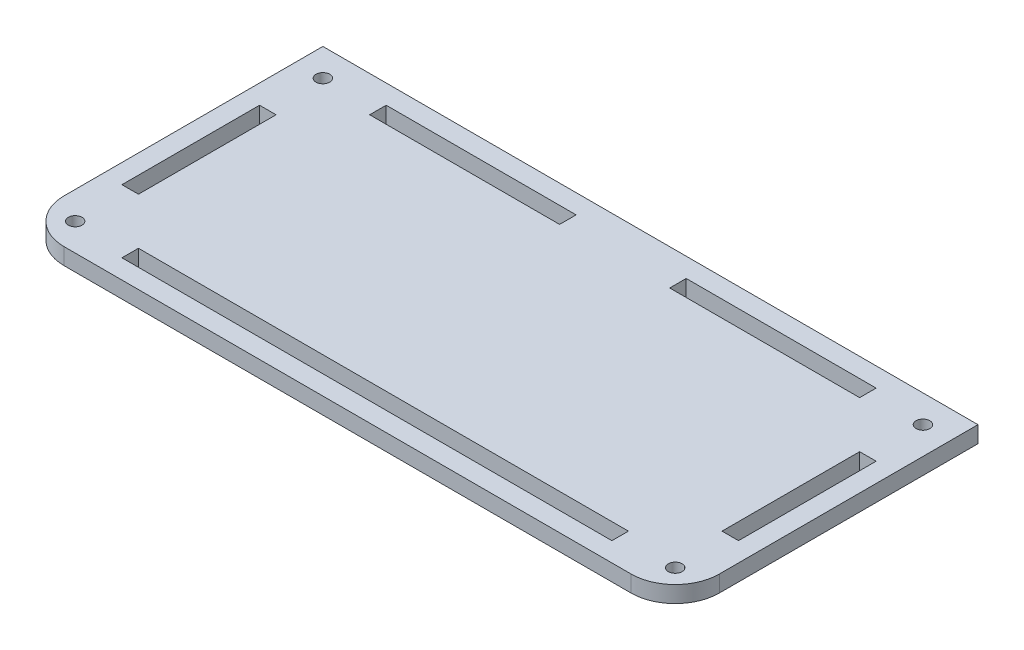
ISO-10303-21;
HEADER;
FILE_DESCRIPTION(('STEP AP214'),'2;1');
FILE_NAME('part.step','',(''),(''),'','','');
FILE_SCHEMA(('AUTOMOTIVE_DESIGN { 1 0 10303 214 1 1 1 1 }'));
ENDSEC;
DATA;
#1=APPLICATION_CONTEXT('core data for automotive mechanical design processes');
#2=APPLICATION_PROTOCOL_DEFINITION('international standard','automotive_design',2000,#1);
#3=PRODUCT_CONTEXT('',#1,'mechanical');
#4=PRODUCT('Part','Part','',(#3));
#5=PRODUCT_RELATED_PRODUCT_CATEGORY('part','',(#4));
#6=PRODUCT_DEFINITION_FORMATION('','',#4);
#7=PRODUCT_DEFINITION_CONTEXT('part definition',#1,'design');
#8=PRODUCT_DEFINITION('design','',#6,#7);
#9=PRODUCT_DEFINITION_SHAPE('','',#8);
#10=(LENGTH_UNIT() NAMED_UNIT(*) SI_UNIT(.MILLI.,.METRE.));
#11=(NAMED_UNIT(*) PLANE_ANGLE_UNIT() SI_UNIT($,.RADIAN.));
#12=(NAMED_UNIT(*) SI_UNIT($,.STERADIAN.) SOLID_ANGLE_UNIT());
#13=UNCERTAINTY_MEASURE_WITH_UNIT(LENGTH_MEASURE(1.E-05),#10,'distance_accuracy_value','');
#14=(GEOMETRIC_REPRESENTATION_CONTEXT(3) GLOBAL_UNCERTAINTY_ASSIGNED_CONTEXT((#13)) GLOBAL_UNIT_ASSIGNED_CONTEXT((#10,
#11,#12)) REPRESENTATION_CONTEXT('',''));
#15=CARTESIAN_POINT('',(0.,0.,0.));
#16=DIRECTION('',(0.,0.,1.));
#17=DIRECTION('',(1.,0.,0.));
#18=AXIS2_PLACEMENT_3D('',#15,#16,#17);
#19=CARTESIAN_POINT('',(59.5,3.,27.5));
#20=DIRECTION('',(-1.,0.,0.));
#21=DIRECTION('',(0.,0.,1.));
#22=AXIS2_PLACEMENT_3D('',#19,#20,#21);
#23=PLANE('',#22);
#24=DIRECTION('',(0.,0.,-1.));
#25=VECTOR('',#24,1.);
#26=CARTESIAN_POINT('',(59.5,3.,27.5));
#27=LINE('',#26,#25);
#28=CARTESIAN_POINT('',(59.5,3.,19.5));
#29=VERTEX_POINT('',#28);
#30=CARTESIAN_POINT('',(59.5,3.,-27.5));
#31=VERTEX_POINT('',#30);
#32=EDGE_CURVE('E388',#29,#31,#27,.T.);
#33=ORIENTED_EDGE('',*,*,#32,.F.);
#34=DIRECTION('',(0.,-1.,0.));
#35=VECTOR('',#34,1.);
#36=CARTESIAN_POINT('',(59.5,3.,19.5));
#37=LINE('',#36,#35);
#38=CARTESIAN_POINT('',(59.5,0.,19.5));
#39=VERTEX_POINT('',#38);
#40=EDGE_CURVE('E431',#29,#39,#37,.T.);
#41=ORIENTED_EDGE('',*,*,#40,.T.);
#42=DIRECTION('',(0.,0.,-1.));
#43=VECTOR('',#42,1.);
#44=CARTESIAN_POINT('',(59.5,0.,27.5));
#45=LINE('',#44,#43);
#46=CARTESIAN_POINT('',(59.5,0.,-27.5));
#47=VERTEX_POINT('',#46);
#48=EDGE_CURVE('E387',#39,#47,#45,.T.);
#49=ORIENTED_EDGE('',*,*,#48,.T.);
#50=DIRECTION('',(0.,-1.,0.));
#51=VECTOR('',#50,1.);
#52=CARTESIAN_POINT('',(59.5,3.,-27.5));
#53=LINE('',#52,#51);
#54=EDGE_CURVE('E413',#31,#47,#53,.T.);
#55=ORIENTED_EDGE('',*,*,#54,.F.);
#56=EDGE_LOOP('',(#33,#41,#49,#55));
#57=FACE_BOUND('',#56,.T.);
#58=ADVANCED_FACE('F41',(#57),#23,.F.);
#59=CARTESIAN_POINT('',(-59.5,3.,-27.5));
#60=DIRECTION('',(0.,0.,1.));
#61=DIRECTION('',(1.,0.,0.));
#62=AXIS2_PLACEMENT_3D('',#59,#60,#61);
#63=PLANE('',#62);
#64=DIRECTION('',(-1.,0.,0.));
#65=VECTOR('',#64,1.);
#66=CARTESIAN_POINT('',(-59.5,0.,-27.5));
#67=LINE('',#66,#65);
#68=CARTESIAN_POINT('',(-59.5,0.,-27.5));
#69=VERTEX_POINT('',#68);
#70=EDGE_CURVE('E403',#47,#69,#67,.T.);
#71=ORIENTED_EDGE('',*,*,#70,.T.);
#72=DIRECTION('',(0.,-1.,0.));
#73=VECTOR('',#72,1.);
#74=CARTESIAN_POINT('',(-59.5,3.,-27.5));
#75=LINE('',#74,#73);
#76=CARTESIAN_POINT('',(-59.5,3.,-27.5));
#77=VERTEX_POINT('',#76);
#78=EDGE_CURVE('E400',#77,#69,#75,.T.);
#79=ORIENTED_EDGE('',*,*,#78,.F.);
#80=DIRECTION('',(-1.,0.,0.));
#81=VECTOR('',#80,1.);
#82=CARTESIAN_POINT('',(-59.5,3.,-27.5));
#83=LINE('',#82,#81);
#84=EDGE_CURVE('E391',#31,#77,#83,.T.);
#85=ORIENTED_EDGE('',*,*,#84,.F.);
#86=ORIENTED_EDGE('',*,*,#54,.T.);
#87=EDGE_LOOP('',(#71,#79,#85,#86));
#88=FACE_BOUND('',#87,.T.);
#89=ADVANCED_FACE('F468',(#88),#63,.F.);
#90=CARTESIAN_POINT('',(-59.5,3.,27.5));
#91=DIRECTION('',(1.,0.,0.));
#92=DIRECTION('',(0.,0.,-1.));
#93=AXIS2_PLACEMENT_3D('',#90,#91,#92);
#94=PLANE('',#93);
#95=DIRECTION('',(0.,0.,1.));
#96=VECTOR('',#95,1.);
#97=CARTESIAN_POINT('',(-59.5,0.,27.5));
#98=LINE('',#97,#96);
#99=CARTESIAN_POINT('',(-59.5,0.,19.5));
#100=VERTEX_POINT('',#99);
#101=EDGE_CURVE('E406',#69,#100,#98,.T.);
#102=ORIENTED_EDGE('',*,*,#101,.T.);
#103=DIRECTION('',(0.,-1.,0.));
#104=VECTOR('',#103,1.);
#105=CARTESIAN_POINT('',(-59.5,3.,19.5));
#106=LINE('',#105,#104);
#107=CARTESIAN_POINT('',(-59.5,3.,19.5));
#108=VERTEX_POINT('',#107);
#109=EDGE_CURVE('E425',#100,#108,#106,.F.);
#110=ORIENTED_EDGE('',*,*,#109,.T.);
#111=DIRECTION('',(0.,0.,1.));
#112=VECTOR('',#111,1.);
#113=CARTESIAN_POINT('',(-59.5,3.,27.5));
#114=LINE('',#113,#112);
#115=EDGE_CURVE('E394',#77,#108,#114,.T.);
#116=ORIENTED_EDGE('',*,*,#115,.F.);
#117=ORIENTED_EDGE('',*,*,#78,.T.);
#118=EDGE_LOOP('',(#102,#110,#116,#117));
#119=FACE_BOUND('',#118,.T.);
#120=ADVANCED_FACE('F474',(#119),#94,.F.);
#121=CARTESIAN_POINT('',(-59.5,3.,27.5));
#122=DIRECTION('',(0.,0.,-1.));
#123=DIRECTION('',(-1.,0.,0.));
#124=AXIS2_PLACEMENT_3D('',#121,#122,#123);
#125=PLANE('',#124);
#126=DIRECTION('',(1.,0.,0.));
#127=VECTOR('',#126,1.);
#128=CARTESIAN_POINT('',(-59.5,3.,27.5));
#129=LINE('',#128,#127);
#130=CARTESIAN_POINT('',(-51.5,3.,27.5));
#131=VERTEX_POINT('',#130);
#132=CARTESIAN_POINT('',(51.5,3.,27.5));
#133=VERTEX_POINT('',#132);
#134=EDGE_CURVE('E397',#131,#133,#129,.T.);
#135=ORIENTED_EDGE('',*,*,#134,.F.);
#136=DIRECTION('',(0.,-1.,0.));
#137=VECTOR('',#136,1.);
#138=CARTESIAN_POINT('',(-51.5,3.,27.5));
#139=LINE('',#138,#137);
#140=CARTESIAN_POINT('',(-51.5,0.,27.5));
#141=VERTEX_POINT('',#140);
#142=EDGE_CURVE('E418',#131,#141,#139,.T.);
#143=ORIENTED_EDGE('',*,*,#142,.T.);
#144=DIRECTION('',(1.,0.,0.));
#145=VECTOR('',#144,1.);
#146=CARTESIAN_POINT('',(-59.5,0.,27.5));
#147=LINE('',#146,#145);
#148=CARTESIAN_POINT('',(51.5,0.,27.5));
#149=VERTEX_POINT('',#148);
#150=EDGE_CURVE('E392',#141,#149,#147,.T.);
#151=ORIENTED_EDGE('',*,*,#150,.T.);
#152=DIRECTION('',(0.,-1.,0.));
#153=VECTOR('',#152,1.);
#154=CARTESIAN_POINT('',(51.5,3.,27.5));
#155=LINE('',#154,#153);
#156=EDGE_CURVE('E416',#149,#133,#155,.F.);
#157=ORIENTED_EDGE('',*,*,#156,.T.);
#158=EDGE_LOOP('',(#135,#143,#151,#157));
#159=FACE_BOUND('',#158,.T.);
#160=ADVANCED_FACE('F500',(#159),#125,.F.);
#161=CARTESIAN_POINT('',(0.,3.,0.));
#162=DIRECTION('',(0.,-1.,0.));
#163=DIRECTION('',(0.,0.,-1.));
#164=AXIS2_PLACEMENT_3D('',#161,#162,#163);
#165=PLANE('',#164);
#166=DIRECTION('',(0.,0.,-1.));
#167=VECTOR('',#166,1.);
#168=CARTESIAN_POINT('',(-10.,3.,-21.));
#169=LINE('',#168,#167);
#170=CARTESIAN_POINT('',(-10.,3.,-21.));
#171=VERTEX_POINT('',#170);
#172=CARTESIAN_POINT('',(-10.,3.,-24.));
#173=VERTEX_POINT('',#172);
#174=EDGE_CURVE('E226',#171,#173,#169,.T.);
#175=ORIENTED_EDGE('',*,*,#174,.F.);
#176=DIRECTION('',(1.,0.,0.));
#177=VECTOR('',#176,1.);
#178=CARTESIAN_POINT('',(-10.,3.,-21.));
#179=LINE('',#178,#177);
#180=CARTESIAN_POINT('',(-44.5,3.,-21.));
#181=VERTEX_POINT('',#180);
#182=EDGE_CURVE('E56',#181,#171,#179,.T.);
#183=ORIENTED_EDGE('',*,*,#182,.F.);
#184=DIRECTION('',(0.,0.,1.));
#185=VECTOR('',#184,1.);
#186=CARTESIAN_POINT('',(-44.5,3.,-24.));
#187=LINE('',#186,#185);
#188=CARTESIAN_POINT('',(-44.5,3.,-24.));
#189=VERTEX_POINT('',#188);
#190=EDGE_CURVE('E233',#189,#181,#187,.T.);
#191=ORIENTED_EDGE('',*,*,#190,.F.);
#192=DIRECTION('',(-1.,0.,0.));
#193=VECTOR('',#192,1.);
#194=CARTESIAN_POINT('',(-10.,3.,-24.));
#195=LINE('',#194,#193);
#196=EDGE_CURVE('E217',#173,#189,#195,.T.);
#197=ORIENTED_EDGE('',*,*,#196,.F.);
#198=EDGE_LOOP('',(#175,#183,#191,#197));
#199=FACE_BOUND('',#198,.T.);
#200=DIRECTION('',(-1.,0.,0.));
#201=VECTOR('',#200,1.);
#202=CARTESIAN_POINT('',(44.5,3.,-24.));
#203=LINE('',#202,#201);
#204=CARTESIAN_POINT('',(44.5,3.,-24.));
#205=VERTEX_POINT('',#204);
#206=CARTESIAN_POINT('',(10.,3.,-24.));
#207=VERTEX_POINT('',#206);
#208=EDGE_CURVE('E244',#205,#207,#203,.T.);
#209=ORIENTED_EDGE('',*,*,#208,.F.);
#210=DIRECTION('',(0.,0.,-1.));
#211=VECTOR('',#210,1.);
#212=CARTESIAN_POINT('',(44.5,3.,-24.));
#213=LINE('',#212,#211);
#214=CARTESIAN_POINT('',(44.5,3.,-21.));
#215=VERTEX_POINT('',#214);
#216=EDGE_CURVE('E240',#215,#205,#213,.T.);
#217=ORIENTED_EDGE('',*,*,#216,.F.);
#218=DIRECTION('',(1.,0.,0.));
#219=VECTOR('',#218,1.);
#220=CARTESIAN_POINT('',(44.5,3.,-21.));
#221=LINE('',#220,#219);
#222=CARTESIAN_POINT('',(10.,3.,-21.));
#223=VERTEX_POINT('',#222);
#224=EDGE_CURVE('E250',#223,#215,#221,.T.);
#225=ORIENTED_EDGE('',*,*,#224,.F.);
#226=DIRECTION('',(0.,0.,1.));
#227=VECTOR('',#226,1.);
#228=CARTESIAN_POINT('',(10.,3.,-21.));
#229=LINE('',#228,#227);
#230=EDGE_CURVE('E247',#207,#223,#229,.T.);
#231=ORIENTED_EDGE('',*,*,#230,.F.);
#232=EDGE_LOOP('',(#209,#217,#225,#231));
#233=FACE_BOUND('',#232,.T.);
#234=DIRECTION('',(-1.,0.,0.));
#235=VECTOR('',#234,1.);
#236=CARTESIAN_POINT('',(-53.,3.,-12.5));
#237=LINE('',#236,#235);
#238=CARTESIAN_POINT('',(-53.,3.,-12.5));
#239=VERTEX_POINT('',#238);
#240=CARTESIAN_POINT('',(-56.,3.,-12.5));
#241=VERTEX_POINT('',#240);
#242=EDGE_CURVE('E278',#239,#241,#237,.T.);
#243=ORIENTED_EDGE('',*,*,#242,.F.);
#244=DIRECTION('',(0.,0.,-1.));
#245=VECTOR('',#244,1.);
#246=CARTESIAN_POINT('',(-53.,3.,12.5));
#247=LINE('',#246,#245);
#248=CARTESIAN_POINT('',(-53.,3.,12.5));
#249=VERTEX_POINT('',#248);
#250=EDGE_CURVE('E256',#249,#239,#247,.T.);
#251=ORIENTED_EDGE('',*,*,#250,.F.);
#252=DIRECTION('',(1.,0.,0.));
#253=VECTOR('',#252,1.);
#254=CARTESIAN_POINT('',(-53.,3.,12.5));
#255=LINE('',#254,#253);
#256=CARTESIAN_POINT('',(-56.,3.,12.5));
#257=VERTEX_POINT('',#256);
#258=EDGE_CURVE('E267',#257,#249,#255,.T.);
#259=ORIENTED_EDGE('',*,*,#258,.F.);
#260=DIRECTION('',(0.,0.,1.));
#261=VECTOR('',#260,1.);
#262=CARTESIAN_POINT('',(-56.,3.,12.5));
#263=LINE('',#262,#261);
#264=EDGE_CURVE('E281',#241,#257,#263,.T.);
#265=ORIENTED_EDGE('',*,*,#264,.F.);
#266=EDGE_LOOP('',(#243,#251,#259,#265));
#267=FACE_BOUND('',#266,.T.);
#268=DIRECTION('',(1.,0.,0.));
#269=VECTOR('',#268,1.);
#270=CARTESIAN_POINT('',(53.,3.,12.5));
#271=LINE('',#270,#269);
#272=CARTESIAN_POINT('',(53.,3.,12.5));
#273=VERTEX_POINT('',#272);
#274=CARTESIAN_POINT('',(56.,3.,12.5));
#275=VERTEX_POINT('',#274);
#276=EDGE_CURVE('E312',#273,#275,#271,.T.);
#277=ORIENTED_EDGE('',*,*,#276,.F.);
#278=DIRECTION('',(0.,0.,1.));
#279=VECTOR('',#278,1.);
#280=CARTESIAN_POINT('',(53.,3.,-12.5));
#281=LINE('',#280,#279);
#282=CARTESIAN_POINT('',(53.,3.,-12.5));
#283=VERTEX_POINT('',#282);
#284=EDGE_CURVE('E288',#283,#273,#281,.T.);
#285=ORIENTED_EDGE('',*,*,#284,.F.);
#286=DIRECTION('',(-1.,0.,0.));
#287=VECTOR('',#286,1.);
#288=CARTESIAN_POINT('',(53.,3.,-12.5));
#289=LINE('',#288,#287);
#290=CARTESIAN_POINT('',(56.,3.,-12.5));
#291=VERTEX_POINT('',#290);
#292=EDGE_CURVE('E299',#291,#283,#289,.T.);
#293=ORIENTED_EDGE('',*,*,#292,.F.);
#294=DIRECTION('',(0.,0.,-1.));
#295=VECTOR('',#294,1.);
#296=CARTESIAN_POINT('',(56.,3.,-12.5));
#297=LINE('',#296,#295);
#298=EDGE_CURVE('E315',#275,#291,#297,.T.);
#299=ORIENTED_EDGE('',*,*,#298,.F.);
#300=EDGE_LOOP('',(#277,#285,#293,#299));
#301=FACE_BOUND('',#300,.T.);
#302=DIRECTION('',(1.,0.,0.));
#303=VECTOR('',#302,1.);
#304=CARTESIAN_POINT('',(-44.5,3.,24.));
#305=LINE('',#304,#303);
#306=CARTESIAN_POINT('',(-44.5,3.,24.));
#307=VERTEX_POINT('',#306);
#308=CARTESIAN_POINT('',(44.5,3.,24.));
#309=VERTEX_POINT('',#308);
#310=EDGE_CURVE('E345',#307,#309,#305,.T.);
#311=ORIENTED_EDGE('',*,*,#310,.F.);
#312=DIRECTION('',(0.,0.,1.));
#313=VECTOR('',#312,1.);
#314=CARTESIAN_POINT('',(-44.5,3.,24.));
#315=LINE('',#314,#313);
#316=CARTESIAN_POINT('',(-44.5,3.,21.));
#317=VERTEX_POINT('',#316);
#318=EDGE_CURVE('E322',#317,#307,#315,.T.);
#319=ORIENTED_EDGE('',*,*,#318,.F.);
#320=DIRECTION('',(-1.,0.,0.));
#321=VECTOR('',#320,1.);
#322=CARTESIAN_POINT('',(-44.5,3.,21.));
#323=LINE('',#322,#321);
#324=CARTESIAN_POINT('',(44.5,3.,21.));
#325=VERTEX_POINT('',#324);
#326=EDGE_CURVE('E334',#325,#317,#323,.T.);
#327=ORIENTED_EDGE('',*,*,#326,.F.);
#328=DIRECTION('',(0.,0.,-1.));
#329=VECTOR('',#328,1.);
#330=CARTESIAN_POINT('',(44.5,3.,24.));
#331=LINE('',#330,#329);
#332=EDGE_CURVE('E348',#309,#325,#331,.T.);
#333=ORIENTED_EDGE('',*,*,#332,.F.);
#334=EDGE_LOOP('',(#311,#319,#327,#333));
#335=FACE_BOUND('',#334,.T.);
#336=CARTESIAN_POINT('',(-54.5,3.,22.5));
#337=DIRECTION('',(0.,1.,0.));
#338=DIRECTION('',(0.,0.,1.));
#339=AXIS2_PLACEMENT_3D('',#336,#337,#338);
#340=CIRCLE('',#339,1.24999999999999);
#341=CARTESIAN_POINT('',(-54.5,3.,23.75));
#342=VERTEX_POINT('',#341);
#343=EDGE_CURVE('E355',#342,#342,#340,.T.);
#344=ORIENTED_EDGE('',*,*,#343,.F.);
#345=EDGE_LOOP('',(#344));
#346=FACE_BOUND('',#345,.T.);
#347=CARTESIAN_POINT('',(54.5,3.,22.5));
#348=DIRECTION('',(0.,1.,0.));
#349=DIRECTION('',(0.,0.,1.));
#350=AXIS2_PLACEMENT_3D('',#347,#348,#349);
#351=CIRCLE('',#350,1.24999999999999);
#352=CARTESIAN_POINT('',(54.5,3.,23.75));
#353=VERTEX_POINT('',#352);
#354=EDGE_CURVE('E367',#353,#353,#351,.T.);
#355=ORIENTED_EDGE('',*,*,#354,.F.);
#356=EDGE_LOOP('',(#355));
#357=FACE_BOUND('',#356,.T.);
#358=CARTESIAN_POINT('',(54.5,3.,-22.5));
#359=DIRECTION('',(0.,1.,0.));
#360=DIRECTION('',(0.,0.,1.));
#361=AXIS2_PLACEMENT_3D('',#358,#359,#360);
#362=CIRCLE('',#361,1.24999999999999);
#363=CARTESIAN_POINT('',(54.5,3.,-21.25));
#364=VERTEX_POINT('',#363);
#365=EDGE_CURVE('E373',#364,#364,#362,.T.);
#366=ORIENTED_EDGE('',*,*,#365,.F.);
#367=EDGE_LOOP('',(#366));
#368=FACE_BOUND('',#367,.T.);
#369=CARTESIAN_POINT('',(-54.5,3.,-22.5));
#370=DIRECTION('',(0.,1.,0.));
#371=DIRECTION('',(0.,0.,1.));
#372=AXIS2_PLACEMENT_3D('',#369,#370,#371);
#373=CIRCLE('',#372,1.24999999999999);
#374=CARTESIAN_POINT('',(-54.5,3.,-21.25));
#375=VERTEX_POINT('',#374);
#376=EDGE_CURVE('E381',#375,#375,#373,.T.);
#377=ORIENTED_EDGE('',*,*,#376,.F.);
#378=EDGE_LOOP('',(#377));
#379=FACE_BOUND('',#378,.T.);
#380=ORIENTED_EDGE('',*,*,#115,.T.);
#381=CARTESIAN_POINT('',(-51.5,3.,19.5));
#382=DIRECTION('',(0.,-1.,0.));
#383=DIRECTION('',(0.,0.,-1.));
#384=AXIS2_PLACEMENT_3D('',#381,#382,#383);
#385=CIRCLE('',#384,8.);
#386=EDGE_CURVE('E429',#108,#131,#385,.F.);
#387=ORIENTED_EDGE('',*,*,#386,.T.);
#388=ORIENTED_EDGE('',*,*,#134,.T.);
#389=CARTESIAN_POINT('',(51.5,3.,19.5));
#390=DIRECTION('',(0.,-1.,0.));
#391=DIRECTION('',(0.,0.,-1.));
#392=AXIS2_PLACEMENT_3D('',#389,#390,#391);
#393=CIRCLE('',#392,8.);
#394=EDGE_CURVE('E427',#133,#29,#393,.F.);
#395=ORIENTED_EDGE('',*,*,#394,.T.);
#396=ORIENTED_EDGE('',*,*,#32,.T.);
#397=ORIENTED_EDGE('',*,*,#84,.T.);
#398=EDGE_LOOP('',(#380,#387,#388,#395,#396,#397));
#399=FACE_BOUND('',#398,.T.);
#400=ADVANCED_FACE('F230',(#199,#233,#267,#301,#335,#346,#357,#368,#379,#399),#165,.F.);
#401=CARTESIAN_POINT('',(0.,0.,0.));
#402=DIRECTION('',(0.,-1.,0.));
#403=DIRECTION('',(0.,0.,-1.));
#404=AXIS2_PLACEMENT_3D('',#401,#402,#403);
#405=PLANE('',#404);
#406=DIRECTION('',(-1.,0.,0.));
#407=VECTOR('',#406,1.);
#408=CARTESIAN_POINT('',(0.,0.,-21.));
#409=LINE('',#408,#407);
#410=CARTESIAN_POINT('',(-10.,0.,-21.));
#411=VERTEX_POINT('',#410);
#412=CARTESIAN_POINT('',(-44.5,0.,-21.));
#413=VERTEX_POINT('',#412);
#414=EDGE_CURVE('E11',#411,#413,#409,.T.);
#415=ORIENTED_EDGE('',*,*,#414,.F.);
#416=DIRECTION('',(0.,0.,1.));
#417=VECTOR('',#416,1.);
#418=CARTESIAN_POINT('',(-10.,0.,0.));
#419=LINE('',#418,#417);
#420=CARTESIAN_POINT('',(-10.,0.,-24.));
#421=VERTEX_POINT('',#420);
#422=EDGE_CURVE('E443',#421,#411,#419,.T.);
#423=ORIENTED_EDGE('',*,*,#422,.F.);
#424=DIRECTION('',(1.,0.,0.));
#425=VECTOR('',#424,1.);
#426=CARTESIAN_POINT('',(0.,0.,-24.));
#427=LINE('',#426,#425);
#428=CARTESIAN_POINT('',(-44.5,0.,-24.));
#429=VERTEX_POINT('',#428);
#430=EDGE_CURVE('E220',#429,#421,#427,.T.);
#431=ORIENTED_EDGE('',*,*,#430,.F.);
#432=DIRECTION('',(0.,0.,-1.));
#433=VECTOR('',#432,1.);
#434=CARTESIAN_POINT('',(-44.5,0.,0.));
#435=LINE('',#434,#433);
#436=EDGE_CURVE('E49',#413,#429,#435,.T.);
#437=ORIENTED_EDGE('',*,*,#436,.F.);
#438=EDGE_LOOP('',(#415,#423,#431,#437));
#439=FACE_BOUND('',#438,.T.);
#440=DIRECTION('',(0.,0.,1.));
#441=VECTOR('',#440,1.);
#442=CARTESIAN_POINT('',(44.5,0.,0.));
#443=LINE('',#442,#441);
#444=CARTESIAN_POINT('',(44.5,0.,-24.));
#445=VERTEX_POINT('',#444);
#446=CARTESIAN_POINT('',(44.5,0.,-21.));
#447=VERTEX_POINT('',#446);
#448=EDGE_CURVE('E441',#445,#447,#443,.T.);
#449=ORIENTED_EDGE('',*,*,#448,.F.);
#450=DIRECTION('',(1.,0.,0.));
#451=VECTOR('',#450,1.);
#452=CARTESIAN_POINT('',(0.,0.,-24.));
#453=LINE('',#452,#451);
#454=CARTESIAN_POINT('',(10.,0.,-24.));
#455=VERTEX_POINT('',#454);
#456=EDGE_CURVE('E434',#455,#445,#453,.T.);
#457=ORIENTED_EDGE('',*,*,#456,.F.);
#458=DIRECTION('',(0.,0.,-1.));
#459=VECTOR('',#458,1.);
#460=CARTESIAN_POINT('',(10.,0.,0.));
#461=LINE('',#460,#459);
#462=CARTESIAN_POINT('',(10.,0.,-21.));
#463=VERTEX_POINT('',#462);
#464=EDGE_CURVE('E436',#463,#455,#461,.T.);
#465=ORIENTED_EDGE('',*,*,#464,.F.);
#466=DIRECTION('',(-1.,0.,0.));
#467=VECTOR('',#466,1.);
#468=CARTESIAN_POINT('',(0.,0.,-21.));
#469=LINE('',#468,#467);
#470=EDGE_CURVE('E439',#447,#463,#469,.T.);
#471=ORIENTED_EDGE('',*,*,#470,.F.);
#472=EDGE_LOOP('',(#449,#457,#465,#471));
#473=FACE_BOUND('',#472,.T.);
#474=DIRECTION('',(0.,0.,-1.));
#475=VECTOR('',#474,1.);
#476=CARTESIAN_POINT('',(-53.,0.,12.5));
#477=LINE('',#476,#475);
#478=CARTESIAN_POINT('',(-53.,0.,12.5));
#479=VERTEX_POINT('',#478);
#480=CARTESIAN_POINT('',(-53.,0.,-12.5));
#481=VERTEX_POINT('',#480);
#482=EDGE_CURVE('E263',#479,#481,#477,.T.);
#483=ORIENTED_EDGE('',*,*,#482,.T.);
#484=DIRECTION('',(-1.,0.,0.));
#485=VECTOR('',#484,1.);
#486=CARTESIAN_POINT('',(-53.,0.,-12.5));
#487=LINE('',#486,#485);
#488=CARTESIAN_POINT('',(-56.,0.,-12.5));
#489=VERTEX_POINT('',#488);
#490=EDGE_CURVE('E266',#481,#489,#487,.T.);
#491=ORIENTED_EDGE('',*,*,#490,.T.);
#492=DIRECTION('',(0.,0.,1.));
#493=VECTOR('',#492,1.);
#494=CARTESIAN_POINT('',(-56.,0.,12.5));
#495=LINE('',#494,#493);
#496=CARTESIAN_POINT('',(-56.,0.,12.5));
#497=VERTEX_POINT('',#496);
#498=EDGE_CURVE('E270',#489,#497,#495,.T.);
#499=ORIENTED_EDGE('',*,*,#498,.T.);
#500=DIRECTION('',(1.,0.,0.));
#501=VECTOR('',#500,1.);
#502=CARTESIAN_POINT('',(-53.,0.,12.5));
#503=LINE('',#502,#501);
#504=EDGE_CURVE('E273',#497,#479,#503,.T.);
#505=ORIENTED_EDGE('',*,*,#504,.T.);
#506=EDGE_LOOP('',(#483,#491,#499,#505));
#507=FACE_BOUND('',#506,.T.);
#508=DIRECTION('',(0.,0.,1.));
#509=VECTOR('',#508,1.);
#510=CARTESIAN_POINT('',(53.,0.,-12.5));
#511=LINE('',#510,#509);
#512=CARTESIAN_POINT('',(53.,0.,-12.5));
#513=VERTEX_POINT('',#512);
#514=CARTESIAN_POINT('',(53.,0.,12.5));
#515=VERTEX_POINT('',#514);
#516=EDGE_CURVE('E295',#513,#515,#511,.T.);
#517=ORIENTED_EDGE('',*,*,#516,.T.);
#518=DIRECTION('',(1.,0.,0.));
#519=VECTOR('',#518,1.);
#520=CARTESIAN_POINT('',(53.,0.,12.5));
#521=LINE('',#520,#519);
#522=CARTESIAN_POINT('',(56.,0.,12.5));
#523=VERTEX_POINT('',#522);
#524=EDGE_CURVE('E298',#515,#523,#521,.T.);
#525=ORIENTED_EDGE('',*,*,#524,.T.);
#526=DIRECTION('',(0.,0.,-1.));
#527=VECTOR('',#526,1.);
#528=CARTESIAN_POINT('',(56.,0.,-12.5));
#529=LINE('',#528,#527);
#530=CARTESIAN_POINT('',(56.,0.,-12.5));
#531=VERTEX_POINT('',#530);
#532=EDGE_CURVE('E302',#523,#531,#529,.T.);
#533=ORIENTED_EDGE('',*,*,#532,.T.);
#534=DIRECTION('',(-1.,0.,0.));
#535=VECTOR('',#534,1.);
#536=CARTESIAN_POINT('',(53.,0.,-12.5));
#537=LINE('',#536,#535);
#538=EDGE_CURVE('E306',#531,#513,#537,.T.);
#539=ORIENTED_EDGE('',*,*,#538,.T.);
#540=EDGE_LOOP('',(#517,#525,#533,#539));
#541=FACE_BOUND('',#540,.T.);
#542=DIRECTION('',(0.,0.,1.));
#543=VECTOR('',#542,1.);
#544=CARTESIAN_POINT('',(-44.5,0.,24.));
#545=LINE('',#544,#543);
#546=CARTESIAN_POINT('',(-44.5,0.,21.));
#547=VERTEX_POINT('',#546);
#548=CARTESIAN_POINT('',(-44.5,0.,24.));
#549=VERTEX_POINT('',#548);
#550=EDGE_CURVE('E330',#547,#549,#545,.T.);
#551=ORIENTED_EDGE('',*,*,#550,.T.);
#552=DIRECTION('',(1.,0.,0.));
#553=VECTOR('',#552,1.);
#554=CARTESIAN_POINT('',(-44.5,0.,24.));
#555=LINE('',#554,#553);
#556=CARTESIAN_POINT('',(44.5,0.,24.));
#557=VERTEX_POINT('',#556);
#558=EDGE_CURVE('E333',#549,#557,#555,.T.);
#559=ORIENTED_EDGE('',*,*,#558,.T.);
#560=DIRECTION('',(0.,0.,-1.));
#561=VECTOR('',#560,1.);
#562=CARTESIAN_POINT('',(44.5,0.,24.));
#563=LINE('',#562,#561);
#564=CARTESIAN_POINT('',(44.5,0.,21.));
#565=VERTEX_POINT('',#564);
#566=EDGE_CURVE('E337',#557,#565,#563,.T.);
#567=ORIENTED_EDGE('',*,*,#566,.T.);
#568=DIRECTION('',(-1.,0.,0.));
#569=VECTOR('',#568,1.);
#570=CARTESIAN_POINT('',(-44.5,0.,21.));
#571=LINE('',#570,#569);
#572=EDGE_CURVE('E340',#565,#547,#571,.T.);
#573=ORIENTED_EDGE('',*,*,#572,.T.);
#574=EDGE_LOOP('',(#551,#559,#567,#573));
#575=FACE_BOUND('',#574,.T.);
#576=CARTESIAN_POINT('',(-54.5,0.,22.5));
#577=DIRECTION('',(0.,1.,0.));
#578=DIRECTION('',(0.,0.,1.));
#579=AXIS2_PLACEMENT_3D('',#576,#577,#578);
#580=CIRCLE('',#579,1.25);
#581=CARTESIAN_POINT('',(-54.5,0.,23.75));
#582=VERTEX_POINT('',#581);
#583=EDGE_CURVE('E364',#582,#582,#580,.T.);
#584=ORIENTED_EDGE('',*,*,#583,.T.);
#585=EDGE_LOOP('',(#584));
#586=FACE_BOUND('',#585,.T.);
#587=CARTESIAN_POINT('',(54.5,0.,22.5));
#588=DIRECTION('',(0.,1.,0.));
#589=DIRECTION('',(0.,0.,1.));
#590=AXIS2_PLACEMENT_3D('',#587,#588,#589);
#591=CIRCLE('',#590,1.25);
#592=CARTESIAN_POINT('',(54.5,0.,23.75));
#593=VERTEX_POINT('',#592);
#594=EDGE_CURVE('E370',#593,#593,#591,.T.);
#595=ORIENTED_EDGE('',*,*,#594,.T.);
#596=EDGE_LOOP('',(#595));
#597=FACE_BOUND('',#596,.T.);
#598=CARTESIAN_POINT('',(54.5,0.,-22.5));
#599=DIRECTION('',(0.,1.,0.));
#600=DIRECTION('',(0.,0.,1.));
#601=AXIS2_PLACEMENT_3D('',#598,#599,#600);
#602=CIRCLE('',#601,1.25);
#603=CARTESIAN_POINT('',(54.5,0.,-21.25));
#604=VERTEX_POINT('',#603);
#605=EDGE_CURVE('E377',#604,#604,#602,.T.);
#606=ORIENTED_EDGE('',*,*,#605,.T.);
#607=EDGE_LOOP('',(#606));
#608=FACE_BOUND('',#607,.T.);
#609=CARTESIAN_POINT('',(-54.5,0.,-22.5));
#610=DIRECTION('',(0.,1.,0.));
#611=DIRECTION('',(0.,0.,1.));
#612=AXIS2_PLACEMENT_3D('',#609,#610,#611);
#613=CIRCLE('',#612,1.25);
#614=CARTESIAN_POINT('',(-54.5,0.,-21.25));
#615=VERTEX_POINT('',#614);
#616=EDGE_CURVE('E384',#615,#615,#613,.T.);
#617=ORIENTED_EDGE('',*,*,#616,.T.);
#618=EDGE_LOOP('',(#617));
#619=FACE_BOUND('',#618,.T.);
#620=ORIENTED_EDGE('',*,*,#150,.F.);
#621=CARTESIAN_POINT('',(-51.5,0.,19.5));
#622=DIRECTION('',(0.,-1.,0.));
#623=DIRECTION('',(0.,0.,-1.));
#624=AXIS2_PLACEMENT_3D('',#621,#622,#623);
#625=CIRCLE('',#624,8.);
#626=EDGE_CURVE('E423',#141,#100,#625,.T.);
#627=ORIENTED_EDGE('',*,*,#626,.T.);
#628=ORIENTED_EDGE('',*,*,#101,.F.);
#629=ORIENTED_EDGE('',*,*,#70,.F.);
#630=ORIENTED_EDGE('',*,*,#48,.F.);
#631=CARTESIAN_POINT('',(51.5,0.,19.5));
#632=DIRECTION('',(0.,-1.,0.));
#633=DIRECTION('',(0.,0.,-1.));
#634=AXIS2_PLACEMENT_3D('',#631,#632,#633);
#635=CIRCLE('',#634,8.);
#636=EDGE_CURVE('E421',#39,#149,#635,.T.);
#637=ORIENTED_EDGE('',*,*,#636,.T.);
#638=EDGE_LOOP('',(#620,#627,#628,#629,#630,#637));
#639=FACE_BOUND('',#638,.T.);
#640=ADVANCED_FACE('F451',(#439,#473,#507,#541,#575,#586,#597,#608,#619,#639),#405,.T.);
#641=CARTESIAN_POINT('',(-54.5,3.,-22.5));
#642=DIRECTION('',(0.,1.,0.));
#643=DIRECTION('',(0.,0.,1.));
#644=AXIS2_PLACEMENT_3D('',#641,#642,#643);
#645=CYLINDRICAL_SURFACE('',#644,1.24999999999999);
#646=ORIENTED_EDGE('',*,*,#616,.F.);
#647=EDGE_LOOP('',(#646));
#648=FACE_BOUND('',#647,.T.);
#649=ORIENTED_EDGE('',*,*,#376,.T.);
#650=EDGE_LOOP('',(#649));
#651=FACE_BOUND('',#650,.T.);
#652=ADVANCED_FACE('F513',(#648,#651),#645,.F.);
#653=CARTESIAN_POINT('',(54.5,3.,-22.5));
#654=DIRECTION('',(0.,1.,0.));
#655=DIRECTION('',(0.,0.,1.));
#656=AXIS2_PLACEMENT_3D('',#653,#654,#655);
#657=CYLINDRICAL_SURFACE('',#656,1.24999999999999);
#658=ORIENTED_EDGE('',*,*,#605,.F.);
#659=EDGE_LOOP('',(#658));
#660=FACE_BOUND('',#659,.T.);
#661=ORIENTED_EDGE('',*,*,#365,.T.);
#662=EDGE_LOOP('',(#661));
#663=FACE_BOUND('',#662,.T.);
#664=ADVANCED_FACE('F519',(#660,#663),#657,.F.);
#665=CARTESIAN_POINT('',(54.5,3.,22.5));
#666=DIRECTION('',(0.,1.,0.));
#667=DIRECTION('',(0.,0.,1.));
#668=AXIS2_PLACEMENT_3D('',#665,#666,#667);
#669=CYLINDRICAL_SURFACE('',#668,1.24999999999999);
#670=ORIENTED_EDGE('',*,*,#594,.F.);
#671=EDGE_LOOP('',(#670));
#672=FACE_BOUND('',#671,.T.);
#673=ORIENTED_EDGE('',*,*,#354,.T.);
#674=EDGE_LOOP('',(#673));
#675=FACE_BOUND('',#674,.T.);
#676=ADVANCED_FACE('F657',(#672,#675),#669,.F.);
#677=CARTESIAN_POINT('',(-54.5,3.,22.5));
#678=DIRECTION('',(0.,1.,0.));
#679=DIRECTION('',(0.,0.,1.));
#680=AXIS2_PLACEMENT_3D('',#677,#678,#679);
#681=CYLINDRICAL_SURFACE('',#680,1.24999999999999);
#682=ORIENTED_EDGE('',*,*,#583,.F.);
#683=EDGE_LOOP('',(#682));
#684=FACE_BOUND('',#683,.T.);
#685=ORIENTED_EDGE('',*,*,#343,.T.);
#686=EDGE_LOOP('',(#685));
#687=FACE_BOUND('',#686,.T.);
#688=ADVANCED_FACE('F653',(#684,#687),#681,.F.);
#689=CARTESIAN_POINT('',(-44.5,0.,24.));
#690=DIRECTION('',(-1.,0.,0.));
#691=DIRECTION('',(0.,0.,1.));
#692=AXIS2_PLACEMENT_3D('',#689,#690,#691);
#693=PLANE('',#692);
#694=ORIENTED_EDGE('',*,*,#318,.T.);
#695=DIRECTION('',(0.,1.,0.));
#696=VECTOR('',#695,1.);
#697=CARTESIAN_POINT('',(-44.5,0.,24.));
#698=LINE('',#697,#696);
#699=EDGE_CURVE('E343',#549,#307,#698,.T.);
#700=ORIENTED_EDGE('',*,*,#699,.F.);
#701=ORIENTED_EDGE('',*,*,#550,.F.);
#702=DIRECTION('',(0.,1.,0.));
#703=VECTOR('',#702,1.);
#704=CARTESIAN_POINT('',(-44.5,0.,21.));
#705=LINE('',#704,#703);
#706=EDGE_CURVE('E353',#547,#317,#705,.T.);
#707=ORIENTED_EDGE('',*,*,#706,.T.);
#708=EDGE_LOOP('',(#694,#700,#701,#707));
#709=FACE_BOUND('',#708,.T.);
#710=ADVANCED_FACE('F643',(#709),#693,.F.);
#711=CARTESIAN_POINT('',(-44.5,0.,21.));
#712=DIRECTION('',(0.,0.,-1.));
#713=DIRECTION('',(-1.,0.,0.));
#714=AXIS2_PLACEMENT_3D('',#711,#712,#713);
#715=PLANE('',#714);
#716=ORIENTED_EDGE('',*,*,#326,.T.);
#717=ORIENTED_EDGE('',*,*,#706,.F.);
#718=ORIENTED_EDGE('',*,*,#572,.F.);
#719=DIRECTION('',(0.,1.,0.));
#720=VECTOR('',#719,1.);
#721=CARTESIAN_POINT('',(44.5,0.,21.));
#722=LINE('',#721,#720);
#723=EDGE_CURVE('E356',#565,#325,#722,.T.);
#724=ORIENTED_EDGE('',*,*,#723,.T.);
#725=EDGE_LOOP('',(#716,#717,#718,#724));
#726=FACE_BOUND('',#725,.T.);
#727=ADVANCED_FACE('F639',(#726),#715,.F.);
#728=CARTESIAN_POINT('',(44.5,0.,24.));
#729=DIRECTION('',(1.,0.,0.));
#730=DIRECTION('',(0.,0.,-1.));
#731=AXIS2_PLACEMENT_3D('',#728,#729,#730);
#732=PLANE('',#731);
#733=ORIENTED_EDGE('',*,*,#332,.T.);
#734=ORIENTED_EDGE('',*,*,#723,.F.);
#735=ORIENTED_EDGE('',*,*,#566,.F.);
#736=DIRECTION('',(0.,1.,0.));
#737=VECTOR('',#736,1.);
#738=CARTESIAN_POINT('',(44.5,0.,24.));
#739=LINE('',#738,#737);
#740=EDGE_CURVE('E358',#557,#309,#739,.T.);
#741=ORIENTED_EDGE('',*,*,#740,.T.);
#742=EDGE_LOOP('',(#733,#734,#735,#741));
#743=FACE_BOUND('',#742,.T.);
#744=ADVANCED_FACE('F642',(#743),#732,.F.);
#745=CARTESIAN_POINT('',(-44.5,0.,24.));
#746=DIRECTION('',(0.,0.,1.));
#747=DIRECTION('',(1.,0.,0.));
#748=AXIS2_PLACEMENT_3D('',#745,#746,#747);
#749=PLANE('',#748);
#750=ORIENTED_EDGE('',*,*,#310,.T.);
#751=ORIENTED_EDGE('',*,*,#740,.F.);
#752=ORIENTED_EDGE('',*,*,#558,.F.);
#753=ORIENTED_EDGE('',*,*,#699,.T.);
#754=EDGE_LOOP('',(#750,#751,#752,#753));
#755=FACE_BOUND('',#754,.T.);
#756=ADVANCED_FACE('F637',(#755),#749,.F.);
#757=CARTESIAN_POINT('',(53.,0.,-12.5));
#758=DIRECTION('',(-1.,0.,0.));
#759=DIRECTION('',(0.,0.,1.));
#760=AXIS2_PLACEMENT_3D('',#757,#758,#759);
#761=PLANE('',#760);
#762=ORIENTED_EDGE('',*,*,#284,.T.);
#763=DIRECTION('',(0.,1.,0.));
#764=VECTOR('',#763,1.);
#765=CARTESIAN_POINT('',(53.,0.,12.5));
#766=LINE('',#765,#764);
#767=EDGE_CURVE('E310',#515,#273,#766,.T.);
#768=ORIENTED_EDGE('',*,*,#767,.F.);
#769=ORIENTED_EDGE('',*,*,#516,.F.);
#770=DIRECTION('',(0.,1.,0.));
#771=VECTOR('',#770,1.);
#772=CARTESIAN_POINT('',(53.,0.,-12.5));
#773=LINE('',#772,#771);
#774=EDGE_CURVE('E320',#513,#283,#773,.T.);
#775=ORIENTED_EDGE('',*,*,#774,.T.);
#776=EDGE_LOOP('',(#762,#768,#769,#775));
#777=FACE_BOUND('',#776,.T.);
#778=ADVANCED_FACE('F627',(#777),#761,.F.);
#779=CARTESIAN_POINT('',(53.,0.,-12.5));
#780=DIRECTION('',(0.,0.,-1.));
#781=DIRECTION('',(-1.,0.,0.));
#782=AXIS2_PLACEMENT_3D('',#779,#780,#781);
#783=PLANE('',#782);
#784=ORIENTED_EDGE('',*,*,#292,.T.);
#785=ORIENTED_EDGE('',*,*,#774,.F.);
#786=ORIENTED_EDGE('',*,*,#538,.F.);
#787=DIRECTION('',(0.,1.,0.));
#788=VECTOR('',#787,1.);
#789=CARTESIAN_POINT('',(56.,0.,-12.5));
#790=LINE('',#789,#788);
#791=EDGE_CURVE('E323',#531,#291,#790,.T.);
#792=ORIENTED_EDGE('',*,*,#791,.T.);
#793=EDGE_LOOP('',(#784,#785,#786,#792));
#794=FACE_BOUND('',#793,.T.);
#795=ADVANCED_FACE('F623',(#794),#783,.F.);
#796=CARTESIAN_POINT('',(56.,0.,-12.5));
#797=DIRECTION('',(1.,0.,0.));
#798=DIRECTION('',(0.,0.,-1.));
#799=AXIS2_PLACEMENT_3D('',#796,#797,#798);
#800=PLANE('',#799);
#801=ORIENTED_EDGE('',*,*,#298,.T.);
#802=ORIENTED_EDGE('',*,*,#791,.F.);
#803=ORIENTED_EDGE('',*,*,#532,.F.);
#804=DIRECTION('',(0.,1.,0.));
#805=VECTOR('',#804,1.);
#806=CARTESIAN_POINT('',(56.,0.,12.5));
#807=LINE('',#806,#805);
#808=EDGE_CURVE('E326',#523,#275,#807,.T.);
#809=ORIENTED_EDGE('',*,*,#808,.T.);
#810=EDGE_LOOP('',(#801,#802,#803,#809));
#811=FACE_BOUND('',#810,.T.);
#812=ADVANCED_FACE('F626',(#811),#800,.F.);
#813=CARTESIAN_POINT('',(53.,0.,12.5));
#814=DIRECTION('',(0.,0.,1.));
#815=DIRECTION('',(1.,0.,0.));
#816=AXIS2_PLACEMENT_3D('',#813,#814,#815);
#817=PLANE('',#816);
#818=ORIENTED_EDGE('',*,*,#276,.T.);
#819=ORIENTED_EDGE('',*,*,#808,.F.);
#820=ORIENTED_EDGE('',*,*,#524,.F.);
#821=ORIENTED_EDGE('',*,*,#767,.T.);
#822=EDGE_LOOP('',(#818,#819,#820,#821));
#823=FACE_BOUND('',#822,.T.);
#824=ADVANCED_FACE('F621',(#823),#817,.F.);
#825=CARTESIAN_POINT('',(-53.,0.,12.5));
#826=DIRECTION('',(1.,0.,0.));
#827=DIRECTION('',(0.,0.,-1.));
#828=AXIS2_PLACEMENT_3D('',#825,#826,#827);
#829=PLANE('',#828);
#830=ORIENTED_EDGE('',*,*,#250,.T.);
#831=DIRECTION('',(0.,1.,0.));
#832=VECTOR('',#831,1.);
#833=CARTESIAN_POINT('',(-53.,0.,-12.5));
#834=LINE('',#833,#832);
#835=EDGE_CURVE('E276',#481,#239,#834,.T.);
#836=ORIENTED_EDGE('',*,*,#835,.F.);
#837=ORIENTED_EDGE('',*,*,#482,.F.);
#838=DIRECTION('',(0.,1.,0.));
#839=VECTOR('',#838,1.);
#840=CARTESIAN_POINT('',(-53.,0.,12.5));
#841=LINE('',#840,#839);
#842=EDGE_CURVE('E286',#479,#249,#841,.T.);
#843=ORIENTED_EDGE('',*,*,#842,.T.);
#844=EDGE_LOOP('',(#830,#836,#837,#843));
#845=FACE_BOUND('',#844,.T.);
#846=ADVANCED_FACE('F614',(#845),#829,.F.);
#847=CARTESIAN_POINT('',(-53.,0.,12.5));
#848=DIRECTION('',(0.,0.,1.));
#849=DIRECTION('',(1.,0.,0.));
#850=AXIS2_PLACEMENT_3D('',#847,#848,#849);
#851=PLANE('',#850);
#852=ORIENTED_EDGE('',*,*,#258,.T.);
#853=ORIENTED_EDGE('',*,*,#842,.F.);
#854=ORIENTED_EDGE('',*,*,#504,.F.);
#855=DIRECTION('',(0.,1.,0.));
#856=VECTOR('',#855,1.);
#857=CARTESIAN_POINT('',(-56.,0.,12.5));
#858=LINE('',#857,#856);
#859=EDGE_CURVE('E289',#497,#257,#858,.T.);
#860=ORIENTED_EDGE('',*,*,#859,.T.);
#861=EDGE_LOOP('',(#852,#853,#854,#860));
#862=FACE_BOUND('',#861,.T.);
#863=ADVANCED_FACE('F611',(#862),#851,.F.);
#864=CARTESIAN_POINT('',(-56.,0.,12.5));
#865=DIRECTION('',(-1.,0.,0.));
#866=DIRECTION('',(0.,0.,1.));
#867=AXIS2_PLACEMENT_3D('',#864,#865,#866);
#868=PLANE('',#867);
#869=ORIENTED_EDGE('',*,*,#264,.T.);
#870=ORIENTED_EDGE('',*,*,#859,.F.);
#871=ORIENTED_EDGE('',*,*,#498,.F.);
#872=DIRECTION('',(0.,1.,0.));
#873=VECTOR('',#872,1.);
#874=CARTESIAN_POINT('',(-56.,0.,-12.5));
#875=LINE('',#874,#873);
#876=EDGE_CURVE('E291',#489,#241,#875,.T.);
#877=ORIENTED_EDGE('',*,*,#876,.T.);
#878=EDGE_LOOP('',(#869,#870,#871,#877));
#879=FACE_BOUND('',#878,.T.);
#880=ADVANCED_FACE('F489',(#879),#868,.F.);
#881=CARTESIAN_POINT('',(-53.,0.,-12.5));
#882=DIRECTION('',(0.,0.,-1.));
#883=DIRECTION('',(-1.,0.,0.));
#884=AXIS2_PLACEMENT_3D('',#881,#882,#883);
#885=PLANE('',#884);
#886=ORIENTED_EDGE('',*,*,#242,.T.);
#887=ORIENTED_EDGE('',*,*,#876,.F.);
#888=ORIENTED_EDGE('',*,*,#490,.F.);
#889=ORIENTED_EDGE('',*,*,#835,.T.);
#890=EDGE_LOOP('',(#886,#887,#888,#889));
#891=FACE_BOUND('',#890,.T.);
#892=ADVANCED_FACE('F481',(#891),#885,.F.);
#893=CARTESIAN_POINT('',(-51.5,3.,19.5));
#894=DIRECTION('',(0.,-1.,0.));
#895=DIRECTION('',(0.,0.,-1.));
#896=AXIS2_PLACEMENT_3D('',#893,#894,#895);
#897=CYLINDRICAL_SURFACE('',#896,8.);
#898=ORIENTED_EDGE('',*,*,#386,.F.);
#899=ORIENTED_EDGE('',*,*,#109,.F.);
#900=ORIENTED_EDGE('',*,*,#626,.F.);
#901=ORIENTED_EDGE('',*,*,#142,.F.);
#902=EDGE_LOOP('',(#898,#899,#900,#901));
#903=FACE_BOUND('',#902,.T.);
#904=ADVANCED_FACE('F479',(#903),#897,.T.);
#905=CARTESIAN_POINT('',(51.5,3.,19.5));
#906=DIRECTION('',(0.,-1.,0.));
#907=DIRECTION('',(0.,0.,-1.));
#908=AXIS2_PLACEMENT_3D('',#905,#906,#907);
#909=CYLINDRICAL_SURFACE('',#908,8.);
#910=ORIENTED_EDGE('',*,*,#394,.F.);
#911=ORIENTED_EDGE('',*,*,#156,.F.);
#912=ORIENTED_EDGE('',*,*,#636,.F.);
#913=ORIENTED_EDGE('',*,*,#40,.F.);
#914=EDGE_LOOP('',(#910,#911,#912,#913));
#915=FACE_BOUND('',#914,.T.);
#916=ADVANCED_FACE('F43',(#915),#909,.T.);
#917=CARTESIAN_POINT('',(44.5,-7.,-24.));
#918=DIRECTION('',(1.,0.,0.));
#919=DIRECTION('',(0.,0.,-1.));
#920=AXIS2_PLACEMENT_3D('',#917,#918,#919);
#921=PLANE('',#920);
#922=ORIENTED_EDGE('',*,*,#448,.T.);
#923=DIRECTION('',(0.,1.,0.));
#924=VECTOR('',#923,1.);
#925=CARTESIAN_POINT('',(44.5,-7.,-21.));
#926=LINE('',#925,#924);
#927=EDGE_CURVE('E254',#447,#215,#926,.T.);
#928=ORIENTED_EDGE('',*,*,#927,.T.);
#929=ORIENTED_EDGE('',*,*,#216,.T.);
#930=DIRECTION('',(0.,1.,0.));
#931=VECTOR('',#930,1.);
#932=CARTESIAN_POINT('',(44.5,-7.,-24.));
#933=LINE('',#932,#931);
#934=EDGE_CURVE('E253',#445,#205,#933,.T.);
#935=ORIENTED_EDGE('',*,*,#934,.F.);
#936=EDGE_LOOP('',(#922,#928,#929,#935));
#937=FACE_BOUND('',#936,.T.);
#938=ADVANCED_FACE('F487',(#937),#921,.F.);
#939=CARTESIAN_POINT('',(44.5,-7.,-21.));
#940=DIRECTION('',(0.,0.,1.));
#941=DIRECTION('',(1.,0.,0.));
#942=AXIS2_PLACEMENT_3D('',#939,#940,#941);
#943=PLANE('',#942);
#944=ORIENTED_EDGE('',*,*,#470,.T.);
#945=DIRECTION('',(0.,1.,0.));
#946=VECTOR('',#945,1.);
#947=CARTESIAN_POINT('',(10.,-7.,-21.));
#948=LINE('',#947,#946);
#949=EDGE_CURVE('E257',#463,#223,#948,.T.);
#950=ORIENTED_EDGE('',*,*,#949,.T.);
#951=ORIENTED_EDGE('',*,*,#224,.T.);
#952=ORIENTED_EDGE('',*,*,#927,.F.);
#953=EDGE_LOOP('',(#944,#950,#951,#952));
#954=FACE_BOUND('',#953,.T.);
#955=ADVANCED_FACE('F557',(#954),#943,.F.);
#956=CARTESIAN_POINT('',(10.,-7.,-21.));
#957=DIRECTION('',(-1.,0.,0.));
#958=DIRECTION('',(0.,0.,1.));
#959=AXIS2_PLACEMENT_3D('',#956,#957,#958);
#960=PLANE('',#959);
#961=ORIENTED_EDGE('',*,*,#464,.T.);
#962=DIRECTION('',(0.,1.,0.));
#963=VECTOR('',#962,1.);
#964=CARTESIAN_POINT('',(10.,-7.,-24.));
#965=LINE('',#964,#963);
#966=EDGE_CURVE('E259',#455,#207,#965,.T.);
#967=ORIENTED_EDGE('',*,*,#966,.T.);
#968=ORIENTED_EDGE('',*,*,#230,.T.);
#969=ORIENTED_EDGE('',*,*,#949,.F.);
#970=EDGE_LOOP('',(#961,#967,#968,#969));
#971=FACE_BOUND('',#970,.T.);
#972=ADVANCED_FACE('F462',(#971),#960,.F.);
#973=CARTESIAN_POINT('',(44.5,-7.,-24.));
#974=DIRECTION('',(0.,0.,-1.));
#975=DIRECTION('',(-1.,0.,0.));
#976=AXIS2_PLACEMENT_3D('',#973,#974,#975);
#977=PLANE('',#976);
#978=ORIENTED_EDGE('',*,*,#456,.T.);
#979=ORIENTED_EDGE('',*,*,#934,.T.);
#980=ORIENTED_EDGE('',*,*,#208,.T.);
#981=ORIENTED_EDGE('',*,*,#966,.F.);
#982=EDGE_LOOP('',(#978,#979,#980,#981));
#983=FACE_BOUND('',#982,.T.);
#984=ADVANCED_FACE('F455',(#983),#977,.F.);
#985=CARTESIAN_POINT('',(-10.,-7.,-21.));
#986=DIRECTION('',(0.,0.,1.));
#987=DIRECTION('',(1.,0.,0.));
#988=AXIS2_PLACEMENT_3D('',#985,#986,#987);
#989=PLANE('',#988);
#990=ORIENTED_EDGE('',*,*,#414,.T.);
#991=DIRECTION('',(0.,1.,0.));
#992=VECTOR('',#991,1.);
#993=CARTESIAN_POINT('',(-44.5,-7.,-21.));
#994=LINE('',#993,#992);
#995=EDGE_CURVE('E238',#413,#181,#994,.T.);
#996=ORIENTED_EDGE('',*,*,#995,.T.);
#997=ORIENTED_EDGE('',*,*,#182,.T.);
#998=DIRECTION('',(0.,1.,0.));
#999=VECTOR('',#998,1.);
#1000=CARTESIAN_POINT('',(-10.,-7.,-21.));
#1001=LINE('',#1000,#999);
#1002=EDGE_CURVE('E223',#411,#171,#1001,.T.);
#1003=ORIENTED_EDGE('',*,*,#1002,.F.);
#1004=EDGE_LOOP('',(#990,#996,#997,#1003));
#1005=FACE_BOUND('',#1004,.T.);
#1006=ADVANCED_FACE('F453',(#1005),#989,.F.);
#1007=CARTESIAN_POINT('',(-44.5,-7.,-24.));
#1008=DIRECTION('',(-1.,0.,0.));
#1009=DIRECTION('',(0.,0.,1.));
#1010=AXIS2_PLACEMENT_3D('',#1007,#1008,#1009);
#1011=PLANE('',#1010);
#1012=ORIENTED_EDGE('',*,*,#436,.T.);
#1013=DIRECTION('',(0.,1.,0.));
#1014=VECTOR('',#1013,1.);
#1015=CARTESIAN_POINT('',(-44.5,-7.,-24.));
#1016=LINE('',#1015,#1014);
#1017=EDGE_CURVE('E222',#429,#189,#1016,.T.);
#1018=ORIENTED_EDGE('',*,*,#1017,.T.);
#1019=ORIENTED_EDGE('',*,*,#190,.T.);
#1020=ORIENTED_EDGE('',*,*,#995,.F.);
#1021=EDGE_LOOP('',(#1012,#1018,#1019,#1020));
#1022=FACE_BOUND('',#1021,.T.);
#1023=ADVANCED_FACE('F448',(#1022),#1011,.F.);
#1024=CARTESIAN_POINT('',(-10.,-7.,-24.));
#1025=DIRECTION('',(0.,0.,-1.));
#1026=DIRECTION('',(-1.,0.,0.));
#1027=AXIS2_PLACEMENT_3D('',#1024,#1025,#1026);
#1028=PLANE('',#1027);
#1029=ORIENTED_EDGE('',*,*,#430,.T.);
#1030=DIRECTION('',(0.,1.,0.));
#1031=VECTOR('',#1030,1.);
#1032=CARTESIAN_POINT('',(-10.,-7.,-24.));
#1033=LINE('',#1032,#1031);
#1034=EDGE_CURVE('E64',#421,#173,#1033,.T.);
#1035=ORIENTED_EDGE('',*,*,#1034,.T.);
#1036=ORIENTED_EDGE('',*,*,#196,.T.);
#1037=ORIENTED_EDGE('',*,*,#1017,.F.);
#1038=EDGE_LOOP('',(#1029,#1035,#1036,#1037));
#1039=FACE_BOUND('',#1038,.T.);
#1040=ADVANCED_FACE('F214',(#1039),#1028,.F.);
#1041=CARTESIAN_POINT('',(-10.,-7.,-21.));
#1042=DIRECTION('',(1.,0.,0.));
#1043=DIRECTION('',(0.,0.,-1.));
#1044=AXIS2_PLACEMENT_3D('',#1041,#1042,#1043);
#1045=PLANE('',#1044);
#1046=ORIENTED_EDGE('',*,*,#422,.T.);
#1047=ORIENTED_EDGE('',*,*,#1002,.T.);
#1048=ORIENTED_EDGE('',*,*,#174,.T.);
#1049=ORIENTED_EDGE('',*,*,#1034,.F.);
#1050=EDGE_LOOP('',(#1046,#1047,#1048,#1049));
#1051=FACE_BOUND('',#1050,.T.);
#1052=ADVANCED_FACE('F227',(#1051),#1045,.F.);
#1053=CLOSED_SHELL('',(#58,#89,#120,#160,#400,#640,#652,#664,#676,#688,#710,#727,#744,#756,#778,
#795,#812,#824,#846,#863,#880,#892,#904,#916,#938,#955,#972,#984,#1006,#1023,#1040,#1052));
#1054=MANIFOLD_SOLID_BREP('B2',#1053);
#1055=ADVANCED_BREP_SHAPE_REPRESENTATION('',(#18,#1054),#14);
#1056=SHAPE_DEFINITION_REPRESENTATION(#9,#1055);
ENDSEC;
END-ISO-10303-21;
